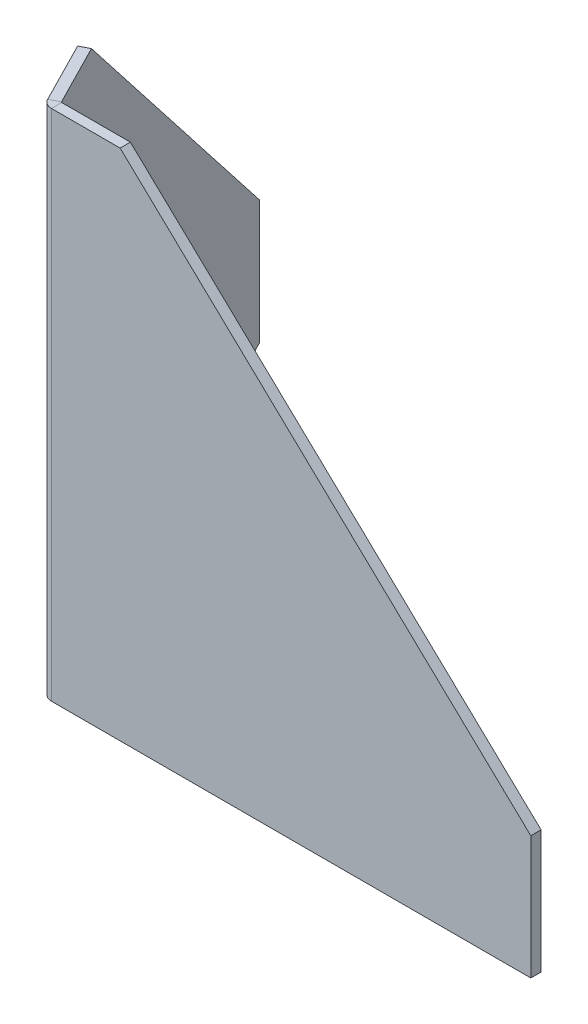
ISO-10303-21;
HEADER;
FILE_DESCRIPTION(('STEP AP214'),'2;1');
FILE_NAME('part.step','',(''),(''),'','','');
FILE_SCHEMA(('AUTOMOTIVE_DESIGN { 1 0 10303 214 1 1 1 1 }'));
ENDSEC;
DATA;
#1=APPLICATION_CONTEXT('core data for automotive mechanical design processes');
#2=APPLICATION_PROTOCOL_DEFINITION('international standard','automotive_design',2000,#1);
#3=PRODUCT_CONTEXT('',#1,'mechanical');
#4=PRODUCT('Part','Part','',(#3));
#5=PRODUCT_RELATED_PRODUCT_CATEGORY('part','',(#4));
#6=PRODUCT_DEFINITION_FORMATION('','',#4);
#7=PRODUCT_DEFINITION_CONTEXT('part definition',#1,'design');
#8=PRODUCT_DEFINITION('design','',#6,#7);
#9=PRODUCT_DEFINITION_SHAPE('','',#8);
#10=(LENGTH_UNIT() NAMED_UNIT(*) SI_UNIT(.MILLI.,.METRE.));
#11=(NAMED_UNIT(*) PLANE_ANGLE_UNIT() SI_UNIT($,.RADIAN.));
#12=(NAMED_UNIT(*) SI_UNIT($,.STERADIAN.) SOLID_ANGLE_UNIT());
#13=UNCERTAINTY_MEASURE_WITH_UNIT(LENGTH_MEASURE(1.E-05),#10,'distance_accuracy_value','');
#14=(GEOMETRIC_REPRESENTATION_CONTEXT(3) GLOBAL_UNCERTAINTY_ASSIGNED_CONTEXT((#13)) GLOBAL_UNIT_ASSIGNED_CONTEXT((#10,
#11,#12)) REPRESENTATION_CONTEXT('',''));
#15=CARTESIAN_POINT('',(0.,0.,0.));
#16=DIRECTION('',(0.,0.,1.));
#17=DIRECTION('',(1.,0.,0.));
#18=AXIS2_PLACEMENT_3D('',#15,#16,#17);
#19=CARTESIAN_POINT('',(-136368.665166535,134167.128561915,49.8948268544208));
#20=DIRECTION('',(0.891006524188369,0.,-0.453990499739545));
#21=DIRECTION('',(-0.453990499739545,0.,-0.891006524188369));
#22=AXIS2_PLACEMENT_3D('',#19,#20,#21);
#23=CYLINDRICAL_SURFACE('',#22,8.49999999999791);
#24=CARTESIAN_POINT('',(-136207.043764723,134167.128561915,-32.4553905518941));
#25=DIRECTION('',(-0.891006524188369,0.,0.453990499739545));
#26=DIRECTION('',(0.453990499739545,0.,0.891006524188369));
#27=AXIS2_PLACEMENT_3D('',#24,#25,#26);
#28=CIRCLE('',#27,8.49999999999791);
#29=CARTESIAN_POINT('',(-136203.184845475,134167.128561915,-24.8818350962948));
#30=VERTEX_POINT('',#29);
#31=EDGE_CURVE('E48',#30,#30,#28,.T.);
#32=ORIENTED_EDGE('',*,*,#31,.T.);
#33=EDGE_LOOP('',(#32));
#34=FACE_BOUND('',#33,.T.);
#35=CARTESIAN_POINT('',(-136198.133699481,134167.128561915,-36.9952955492886));
#36=DIRECTION('',(-0.891006524188369,0.,0.453990499739545));
#37=DIRECTION('',(0.453990499739545,0.,0.891006524188369));
#38=AXIS2_PLACEMENT_3D('',#35,#36,#37);
#39=CIRCLE('',#38,8.49999999999791);
#40=CARTESIAN_POINT('',(-136194.274780233,134167.128561915,-29.4217400936894));
#41=VERTEX_POINT('',#40);
#42=EDGE_CURVE('E12',#41,#41,#39,.T.);
#43=ORIENTED_EDGE('',*,*,#42,.F.);
#44=EDGE_LOOP('',(#43));
#45=FACE_BOUND('',#44,.T.);
#46=ADVANCED_FACE('F41',(#34,#45),#23,.F.);
#47=CARTESIAN_POINT('',(-136214.931347972,134227.128561915,-69.96253694426));
#48=DIRECTION('',(0.,1.,0.));
#49=DIRECTION('',(-0.891006524188369,0.,0.453990499739545));
#50=AXIS2_PLACEMENT_3D('',#47,#48,#49);
#51=PLANE('',#50);
#52=DIRECTION('',(-0.453990499739545,0.,-0.891006524188369));
#53=VECTOR('',#52,1.);
#54=CARTESIAN_POINT('',(-136223.841413213,134227.128561915,-65.4226319468592));
#55=LINE('',#54,#53);
#56=CARTESIAN_POINT('',(-136193.493900969,134227.128561915,-5.86228560048596));
#57=VERTEX_POINT('',#56);
#58=CARTESIAN_POINT('',(-136223.841413213,134227.128561915,-65.4226319468592));
#59=VERTEX_POINT('',#58);
#60=EDGE_CURVE('E63',#57,#59,#55,.T.);
#61=ORIENTED_EDGE('',*,*,#60,.F.);
#62=DIRECTION('',(0.891006524188369,0.,-0.453990499739545));
#63=VECTOR('',#62,1.);
#64=CARTESIAN_POINT('',(-136184.583835727,134227.128561915,-10.4021905978868));
#65=LINE('',#64,#63);
#66=CARTESIAN_POINT('',(-136184.583835727,134227.128561915,-10.402190597886));
#67=VERTEX_POINT('',#66);
#68=EDGE_CURVE('E116',#57,#67,#65,.T.);
#69=ORIENTED_EDGE('',*,*,#68,.T.);
#70=DIRECTION('',(-0.453990499739545,0.,-0.891006524188369));
#71=VECTOR('',#70,1.);
#72=CARTESIAN_POINT('',(-136214.931347972,134227.128561915,-69.96253694426));
#73=LINE('',#72,#71);
#74=CARTESIAN_POINT('',(-136214.931347972,134227.128561915,-69.96253694426));
#75=VERTEX_POINT('',#74);
#76=EDGE_CURVE('E119',#67,#75,#73,.T.);
#77=ORIENTED_EDGE('',*,*,#76,.T.);
#78=DIRECTION('',(-0.891006524188369,0.,0.453990499739545));
#79=VECTOR('',#78,1.);
#80=CARTESIAN_POINT('',(-136214.931347972,134227.128561915,-69.96253694426));
#81=LINE('',#80,#79);
#82=EDGE_CURVE('E149',#75,#59,#81,.T.);
#83=ORIENTED_EDGE('',*,*,#82,.T.);
#84=EDGE_LOOP('',(#61,#69,#77,#83));
#85=FACE_BOUND('',#84,.T.);
#86=ADVANCED_FACE('F118',(#85),#51,.T.);
#87=CARTESIAN_POINT('',(-136385.177785374,133727.128561915,-404.089983514908));
#88=DIRECTION('',(0.,-1.,0.));
#89=DIRECTION('',(0.891006524188369,0.,-0.453990499739545));
#90=AXIS2_PLACEMENT_3D('',#87,#88,#89);
#91=PLANE('',#90);
#92=DIRECTION('',(0.453990499739545,0.,0.891006524188369));
#93=VECTOR('',#92,1.);
#94=CARTESIAN_POINT('',(-136385.177785374,133727.128561915,-404.089983514908));
#95=LINE('',#94,#93);
#96=CARTESIAN_POINT('',(-136385.177785374,133727.128561915,-404.089983514908));
#97=VERTEX_POINT('',#96);
#98=CARTESIAN_POINT('',(-136184.583835727,133727.128561915,-10.4021905978868));
#99=VERTEX_POINT('',#98);
#100=EDGE_CURVE('E139',#97,#99,#95,.T.);
#101=ORIENTED_EDGE('',*,*,#100,.T.);
#102=DIRECTION('',(-0.891006524188369,0.,0.453990499739545));
#103=VECTOR('',#102,1.);
#104=CARTESIAN_POINT('',(-136184.583835727,133727.128561915,-10.4021905978868));
#105=LINE('',#104,#103);
#106=CARTESIAN_POINT('',(-136193.493900969,133727.128561915,-5.86228560048596));
#107=VERTEX_POINT('',#106);
#108=EDGE_CURVE('E216',#99,#107,#105,.T.);
#109=ORIENTED_EDGE('',*,*,#108,.T.);
#110=DIRECTION('',(0.453990499739545,0.,0.891006524188369));
#111=VECTOR('',#110,1.);
#112=CARTESIAN_POINT('',(-136394.087850616,133727.128561915,-399.550078517507));
#113=LINE('',#112,#111);
#114=CARTESIAN_POINT('',(-136394.087850616,133727.128561915,-399.550078517507));
#115=VERTEX_POINT('',#114);
#116=EDGE_CURVE('E55',#115,#107,#113,.T.);
#117=ORIENTED_EDGE('',*,*,#116,.F.);
#118=DIRECTION('',(-0.891006524188369,0.,0.453990499739545));
#119=VECTOR('',#118,1.);
#120=CARTESIAN_POINT('',(-136385.177785374,133727.128561915,-404.089983514908));
#121=LINE('',#120,#119);
#122=EDGE_CURVE('E212',#97,#115,#121,.T.);
#123=ORIENTED_EDGE('',*,*,#122,.F.);
#124=EDGE_LOOP('',(#101,#109,#117,#123));
#125=FACE_BOUND('',#124,.T.);
#126=ADVANCED_FACE('F232',(#125),#91,.T.);
#127=CARTESIAN_POINT('',(-74364.4209440493,0.,121340.525845296));
#128=DIRECTION('',(-0.891006524188369,0.,0.453990499739545));
#129=DIRECTION('',(0.453990499739545,0.,0.891006524188369));
#130=AXIS2_PLACEMENT_3D('',#127,#128,#129);
#131=PLANE('',#130);
#132=CARTESIAN_POINT('',(-136207.043764723,133977.128561915,-32.4553905518941));
#133=DIRECTION('',(-0.891006524188369,0.,0.453990499739545));
#134=DIRECTION('',(0.453990499739545,0.,0.891006524188369));
#135=AXIS2_PLACEMENT_3D('',#132,#133,#134);
#136=CIRCLE('',#135,8.49999999999791);
#137=CARTESIAN_POINT('',(-136203.184845475,133977.128561915,-24.8818350962948));
#138=VERTEX_POINT('',#137);
#139=EDGE_CURVE('E306',#138,#138,#136,.T.);
#140=ORIENTED_EDGE('',*,*,#139,.F.);
#141=EDGE_LOOP('',(#140));
#142=FACE_BOUND('',#141,.T.);
#143=CARTESIAN_POINT('',(-136207.043764723,133787.128561915,-32.4553905518941));
#144=DIRECTION('',(-0.891006524188369,0.,0.453990499739545));
#145=DIRECTION('',(0.453990499739545,0.,0.891006524188369));
#146=AXIS2_PLACEMENT_3D('',#143,#144,#145);
#147=CIRCLE('',#146,8.49999999999791);
#148=CARTESIAN_POINT('',(-136203.184845475,133787.128561915,-24.8818350962948));
#149=VERTEX_POINT('',#148);
#150=EDGE_CURVE('E168',#149,#149,#147,.T.);
#151=ORIENTED_EDGE('',*,*,#150,.F.);
#152=EDGE_LOOP('',(#151));
#153=FACE_BOUND('',#152,.T.);
#154=ORIENTED_EDGE('',*,*,#116,.T.);
#155=DIRECTION('',(0.,1.,0.));
#156=VECTOR('',#155,1.);
#157=CARTESIAN_POINT('',(-136193.493900969,0.,-5.86228560048596));
#158=LINE('',#157,#156);
#159=EDGE_CURVE('E125',#107,#57,#158,.T.);
#160=ORIENTED_EDGE('',*,*,#159,.T.);
#161=ORIENTED_EDGE('',*,*,#60,.T.);
#162=DIRECTION('',(-0.318886809529834,-0.711773999328797,-0.625850602450276));
#163=VECTOR('',#162,1.);
#164=CARTESIAN_POINT('',(-136394.087850616,133847.128561915,-399.550078517507));
#165=LINE('',#164,#163);
#166=CARTESIAN_POINT('',(-136394.087850616,133847.128561915,-399.550078517507));
#167=VERTEX_POINT('',#166);
#168=EDGE_CURVE('E172',#59,#167,#165,.T.);
#169=ORIENTED_EDGE('',*,*,#168,.T.);
#170=DIRECTION('',(0.,-1.,0.));
#171=VECTOR('',#170,1.);
#172=CARTESIAN_POINT('',(-136394.087850616,133727.128561915,-399.550078517507));
#173=LINE('',#172,#171);
#174=EDGE_CURVE('E209',#167,#115,#173,.T.);
#175=ORIENTED_EDGE('',*,*,#174,.T.);
#176=EDGE_LOOP('',(#154,#160,#161,#169,#175));
#177=FACE_BOUND('',#176,.T.);
#178=ORIENTED_EDGE('',*,*,#31,.F.);
#179=EDGE_LOOP('',(#178));
#180=FACE_BOUND('',#179,.T.);
#181=ADVANCED_FACE('F229',(#142,#153,#177,#180),#131,.T.);
#182=CARTESIAN_POINT('',(-136385.177785374,133847.128561915,-404.089983514908));
#183=DIRECTION('',(-0.323138633656895,0.702408551969216,-0.634195277149605));
#184=DIRECTION('',(-0.318886809529834,-0.711773999328797,-0.625850602450276));
#185=AXIS2_PLACEMENT_3D('',#182,#183,#184);
#186=PLANE('',#185);
#187=ORIENTED_EDGE('',*,*,#168,.F.);
#188=ORIENTED_EDGE('',*,*,#82,.F.);
#189=DIRECTION('',(-0.318886809529834,-0.711773999328797,-0.625850602450276));
#190=VECTOR('',#189,1.);
#191=CARTESIAN_POINT('',(-136385.177785374,133847.128561915,-404.089983514908));
#192=LINE('',#191,#190);
#193=CARTESIAN_POINT('',(-136385.177785374,133847.128561915,-404.089983514908));
#194=VERTEX_POINT('',#193);
#195=EDGE_CURVE('E137',#75,#194,#192,.T.);
#196=ORIENTED_EDGE('',*,*,#195,.T.);
#197=DIRECTION('',(-0.891006524188369,0.,0.453990499739545));
#198=VECTOR('',#197,1.);
#199=CARTESIAN_POINT('',(-136385.177785374,133847.128561915,-404.089983514908));
#200=LINE('',#199,#198);
#201=EDGE_CURVE('E138',#194,#167,#200,.T.);
#202=ORIENTED_EDGE('',*,*,#201,.T.);
#203=EDGE_LOOP('',(#187,#188,#196,#202));
#204=FACE_BOUND('',#203,.T.);
#205=ADVANCED_FACE('F231',(#204),#186,.T.);
#206=CARTESIAN_POINT('',(-136385.177785374,133727.128561915,-404.089983514908));
#207=DIRECTION('',(-0.453990499739545,0.,-0.891006524188369));
#208=DIRECTION('',(-0.891006524188369,0.,0.453990499739545));
#209=AXIS2_PLACEMENT_3D('',#206,#207,#208);
#210=PLANE('',#209);
#211=ORIENTED_EDGE('',*,*,#174,.F.);
#212=ORIENTED_EDGE('',*,*,#201,.F.);
#213=DIRECTION('',(0.,-1.,0.));
#214=VECTOR('',#213,1.);
#215=CARTESIAN_POINT('',(-136385.177785374,133727.128561915,-404.089983514908));
#216=LINE('',#215,#214);
#217=EDGE_CURVE('E204',#194,#97,#216,.T.);
#218=ORIENTED_EDGE('',*,*,#217,.T.);
#219=ORIENTED_EDGE('',*,*,#122,.T.);
#220=EDGE_LOOP('',(#211,#212,#218,#219));
#221=FACE_BOUND('',#220,.T.);
#222=ADVANCED_FACE('F239',(#221),#210,.T.);
#223=CARTESIAN_POINT('',(-74355.5108788075,0.,121335.985940298));
#224=DIRECTION('',(-0.891006524188369,0.,0.453990499739545));
#225=DIRECTION('',(0.453990499739545,0.,0.891006524188369));
#226=AXIS2_PLACEMENT_3D('',#223,#224,#225);
#227=PLANE('',#226);
#228=CARTESIAN_POINT('',(-136198.133699481,133977.128561915,-36.9952955492886));
#229=DIRECTION('',(-0.891006524188369,0.,0.453990499739545));
#230=DIRECTION('',(0.453990499739545,0.,0.891006524188369));
#231=AXIS2_PLACEMENT_3D('',#228,#229,#230);
#232=CIRCLE('',#231,8.49999999999791);
#233=CARTESIAN_POINT('',(-136194.274780233,133977.128561915,-29.4217400936894));
#234=VERTEX_POINT('',#233);
#235=EDGE_CURVE('E223',#234,#234,#232,.T.);
#236=ORIENTED_EDGE('',*,*,#235,.T.);
#237=EDGE_LOOP('',(#236));
#238=FACE_BOUND('',#237,.T.);
#239=CARTESIAN_POINT('',(-136198.133699481,133787.128561915,-36.9952955492886));
#240=DIRECTION('',(-0.891006524188369,0.,0.453990499739545));
#241=DIRECTION('',(0.453990499739545,0.,0.891006524188369));
#242=AXIS2_PLACEMENT_3D('',#239,#240,#241);
#243=CIRCLE('',#242,8.49999999999791);
#244=CARTESIAN_POINT('',(-136194.274780233,133787.128561915,-29.4217400936894));
#245=VERTEX_POINT('',#244);
#246=EDGE_CURVE('E221',#245,#245,#243,.T.);
#247=ORIENTED_EDGE('',*,*,#246,.T.);
#248=EDGE_LOOP('',(#247));
#249=FACE_BOUND('',#248,.T.);
#250=DIRECTION('',(0.,1.,0.));
#251=VECTOR('',#250,1.);
#252=CARTESIAN_POINT('',(-136184.583835727,0.,-10.4021905978868));
#253=LINE('',#252,#251);
#254=EDGE_CURVE('E126',#99,#67,#253,.T.);
#255=ORIENTED_EDGE('',*,*,#254,.F.);
#256=ORIENTED_EDGE('',*,*,#100,.F.);
#257=ORIENTED_EDGE('',*,*,#217,.F.);
#258=ORIENTED_EDGE('',*,*,#195,.F.);
#259=ORIENTED_EDGE('',*,*,#76,.F.);
#260=EDGE_LOOP('',(#255,#256,#257,#258,#259));
#261=FACE_BOUND('',#260,.T.);
#262=ORIENTED_EDGE('',*,*,#42,.T.);
#263=EDGE_LOOP('',(#262));
#264=FACE_BOUND('',#263,.T.);
#265=ADVANCED_FACE('F131',(#238,#249,#261,#264),#227,.F.);
#266=CARTESIAN_POINT('',(-135717.081380895,133727.128561915,-10.));
#267=DIRECTION('',(1.,0.,0.));
#268=DIRECTION('',(0.,0.,-1.));
#269=AXIS2_PLACEMENT_3D('',#266,#267,#268);
#270=PLANE('',#269);
#271=DIRECTION('',(0.,1.,0.));
#272=VECTOR('',#271,1.);
#273=CARTESIAN_POINT('',(-135717.081380895,133727.128561915,0.));
#274=LINE('',#273,#272);
#275=CARTESIAN_POINT('',(-135717.081380895,133727.128561915,0.));
#276=VERTEX_POINT('',#275);
#277=CARTESIAN_POINT('',(-135717.081380895,133847.128561915,0.));
#278=VERTEX_POINT('',#277);
#279=EDGE_CURVE('E180',#276,#278,#274,.T.);
#280=ORIENTED_EDGE('',*,*,#279,.F.);
#281=DIRECTION('',(0.,0.,1.));
#282=VECTOR('',#281,1.);
#283=CARTESIAN_POINT('',(-135717.081380895,133727.128561915,-10.));
#284=LINE('',#283,#282);
#285=CARTESIAN_POINT('',(-135717.081380895,133727.128561915,-10.));
#286=VERTEX_POINT('',#285);
#287=EDGE_CURVE('E169',#286,#276,#284,.T.);
#288=ORIENTED_EDGE('',*,*,#287,.F.);
#289=DIRECTION('',(0.,1.,0.));
#290=VECTOR('',#289,1.);
#291=CARTESIAN_POINT('',(-135717.081380895,133727.128561915,-10.));
#292=LINE('',#291,#290);
#293=CARTESIAN_POINT('',(-135717.081380895,133847.128561915,-10.));
#294=VERTEX_POINT('',#293);
#295=EDGE_CURVE('E197',#286,#294,#292,.T.);
#296=ORIENTED_EDGE('',*,*,#295,.T.);
#297=DIRECTION('',(0.,0.,1.));
#298=VECTOR('',#297,1.);
#299=CARTESIAN_POINT('',(-135717.081380895,133847.128561915,-10.));
#300=LINE('',#299,#298);
#301=EDGE_CURVE('E195',#294,#278,#300,.T.);
#302=ORIENTED_EDGE('',*,*,#301,.T.);
#303=EDGE_LOOP('',(#280,#288,#296,#302));
#304=FACE_BOUND('',#303,.T.);
#305=ADVANCED_FACE('F254',(#304),#270,.T.);
#306=CARTESIAN_POINT('',(-135717.081380895,133847.128561915,-10.));
#307=DIRECTION('',(0.688749461914709,0.724999433594398,0.));
#308=DIRECTION('',(-0.724999433594398,0.688749461914709,0.));
#309=AXIS2_PLACEMENT_3D('',#306,#307,#308);
#310=PLANE('',#309);
#311=DIRECTION('',(-0.724999433594398,0.688749461914709,0.));
#312=VECTOR('',#311,1.);
#313=CARTESIAN_POINT('',(-135717.081380895,133847.128561915,0.));
#314=LINE('',#313,#312);
#315=CARTESIAN_POINT('',(-136117.081380895,134227.128561915,0.));
#316=VERTEX_POINT('',#315);
#317=EDGE_CURVE('E177',#278,#316,#314,.T.);
#318=ORIENTED_EDGE('',*,*,#317,.F.);
#319=ORIENTED_EDGE('',*,*,#301,.F.);
#320=DIRECTION('',(-0.724999433594398,0.688749461914709,0.));
#321=VECTOR('',#320,1.);
#322=CARTESIAN_POINT('',(-135717.081380895,133847.128561915,-10.));
#323=LINE('',#322,#321);
#324=CARTESIAN_POINT('',(-136117.081380895,134227.128561915,-10.));
#325=VERTEX_POINT('',#324);
#326=EDGE_CURVE('E192',#294,#325,#323,.T.);
#327=ORIENTED_EDGE('',*,*,#326,.T.);
#328=DIRECTION('',(0.,0.,1.));
#329=VECTOR('',#328,1.);
#330=CARTESIAN_POINT('',(-136117.081380895,134227.128561915,-10.));
#331=LINE('',#330,#329);
#332=EDGE_CURVE('E190',#325,#316,#331,.T.);
#333=ORIENTED_EDGE('',*,*,#332,.T.);
#334=EDGE_LOOP('',(#318,#319,#327,#333));
#335=FACE_BOUND('',#334,.T.);
#336=ADVANCED_FACE('F276',(#335),#310,.T.);
#337=CARTESIAN_POINT('',(0.,0.,-10.));
#338=DIRECTION('',(0.,0.,1.));
#339=DIRECTION('',(1.,0.,0.));
#340=AXIS2_PLACEMENT_3D('',#337,#338,#339);
#341=PLANE('',#340);
#342=DIRECTION('',(1.,0.,0.));
#343=VECTOR('',#342,1.);
#344=CARTESIAN_POINT('',(-136632.081380895,133727.128561915,-10.));
#345=LINE('',#344,#343);
#346=CARTESIAN_POINT('',(-136183.927520322,133727.128561915,-10.));
#347=VERTEX_POINT('',#346);
#348=EDGE_CURVE('E173',#347,#286,#345,.T.);
#349=ORIENTED_EDGE('',*,*,#348,.F.);
#350=DIRECTION('',(0.,1.,0.));
#351=VECTOR('',#350,1.);
#352=CARTESIAN_POINT('',(-136183.927520322,0.,-10.));
#353=LINE('',#352,#351);
#354=CARTESIAN_POINT('',(-136183.927520322,134227.128561915,-10.0000000000035));
#355=VERTEX_POINT('',#354);
#356=EDGE_CURVE('E187',#347,#355,#353,.T.);
#357=ORIENTED_EDGE('',*,*,#356,.T.);
#358=DIRECTION('',(-1.,0.,0.));
#359=VECTOR('',#358,1.);
#360=CARTESIAN_POINT('',(-136257.081380895,134227.128561915,-10.));
#361=LINE('',#360,#359);
#362=EDGE_CURVE('E185',#325,#355,#361,.T.);
#363=ORIENTED_EDGE('',*,*,#362,.F.);
#364=ORIENTED_EDGE('',*,*,#326,.F.);
#365=ORIENTED_EDGE('',*,*,#295,.F.);
#366=EDGE_LOOP('',(#349,#357,#363,#364,#365));
#367=FACE_BOUND('',#366,.T.);
#368=ADVANCED_FACE('F272',(#367),#341,.F.);
#369=CARTESIAN_POINT('',(-136257.081380895,134227.128561915,-10.));
#370=DIRECTION('',(0.,1.,0.));
#371=DIRECTION('',(0.,0.,1.));
#372=AXIS2_PLACEMENT_3D('',#369,#370,#371);
#373=PLANE('',#372);
#374=DIRECTION('',(0.,0.,-1.));
#375=VECTOR('',#374,1.);
#376=CARTESIAN_POINT('',(-136183.927520322,134227.128561915,-10.));
#377=LINE('',#376,#375);
#378=CARTESIAN_POINT('',(-136183.927520322,134227.128561915,0.));
#379=VERTEX_POINT('',#378);
#380=EDGE_CURVE('E154',#379,#355,#377,.T.);
#381=ORIENTED_EDGE('',*,*,#380,.F.);
#382=DIRECTION('',(-1.,0.,0.));
#383=VECTOR('',#382,1.);
#384=CARTESIAN_POINT('',(-136257.081380895,134227.128561915,0.));
#385=LINE('',#384,#383);
#386=EDGE_CURVE('E175',#316,#379,#385,.T.);
#387=ORIENTED_EDGE('',*,*,#386,.F.);
#388=ORIENTED_EDGE('',*,*,#332,.F.);
#389=ORIENTED_EDGE('',*,*,#362,.T.);
#390=EDGE_LOOP('',(#381,#387,#388,#389));
#391=FACE_BOUND('',#390,.T.);
#392=ADVANCED_FACE('F268',(#391),#373,.T.);
#393=CARTESIAN_POINT('',(0.,0.,0.));
#394=DIRECTION('',(0.,0.,1.));
#395=DIRECTION('',(1.,0.,0.));
#396=AXIS2_PLACEMENT_3D('',#393,#394,#395);
#397=PLANE('',#396);
#398=DIRECTION('',(0.,1.,0.));
#399=VECTOR('',#398,1.);
#400=CARTESIAN_POINT('',(-136183.927520322,0.,0.));
#401=LINE('',#400,#399);
#402=CARTESIAN_POINT('',(-136183.927520322,133727.128561915,0.));
#403=VERTEX_POINT('',#402);
#404=EDGE_CURVE('E158',#403,#379,#401,.T.);
#405=ORIENTED_EDGE('',*,*,#404,.F.);
#406=DIRECTION('',(1.,0.,0.));
#407=VECTOR('',#406,1.);
#408=CARTESIAN_POINT('',(-136632.081380895,133727.128561915,0.));
#409=LINE('',#408,#407);
#410=EDGE_CURVE('E183',#403,#276,#409,.T.);
#411=ORIENTED_EDGE('',*,*,#410,.T.);
#412=ORIENTED_EDGE('',*,*,#279,.T.);
#413=ORIENTED_EDGE('',*,*,#317,.T.);
#414=ORIENTED_EDGE('',*,*,#386,.T.);
#415=EDGE_LOOP('',(#405,#411,#412,#413,#414));
#416=FACE_BOUND('',#415,.T.);
#417=ADVANCED_FACE('F264',(#416),#397,.T.);
#418=CARTESIAN_POINT('',(-136632.081380895,133727.128561915,-10.));
#419=DIRECTION('',(0.,-1.,0.));
#420=DIRECTION('',(0.,0.,-1.));
#421=AXIS2_PLACEMENT_3D('',#418,#419,#420);
#422=PLANE('',#421);
#423=DIRECTION('',(0.,0.,1.));
#424=VECTOR('',#423,1.);
#425=CARTESIAN_POINT('',(-136183.927520322,133727.128561915,-10.));
#426=LINE('',#425,#424);
#427=EDGE_CURVE('E155',#347,#403,#426,.T.);
#428=ORIENTED_EDGE('',*,*,#427,.F.);
#429=ORIENTED_EDGE('',*,*,#348,.T.);
#430=ORIENTED_EDGE('',*,*,#287,.T.);
#431=ORIENTED_EDGE('',*,*,#410,.F.);
#432=EDGE_LOOP('',(#428,#429,#430,#431));
#433=FACE_BOUND('',#432,.T.);
#434=ADVANCED_FACE('F260',(#433),#422,.T.);
#435=CARTESIAN_POINT('',(-136183.927520322,133727.128561915,-10.7366));
#436=DIRECTION('',(0.,1.,0.));
#437=DIRECTION('',(0.,0.,1.));
#438=AXIS2_PLACEMENT_3D('',#435,#436,#437);
#439=PLANE('',#438);
#440=ORIENTED_EDGE('',*,*,#427,.T.);
#441=CARTESIAN_POINT('',(-136183.927520322,133727.128561915,-10.7366));
#442=DIRECTION('',(0.,1.,0.));
#443=DIRECTION('',(0.,0.,1.));
#444=AXIS2_PLACEMENT_3D('',#441,#442,#443);
#445=CIRCLE('',#444,10.7366);
#446=EDGE_CURVE('E165',#403,#107,#445,.F.);
#447=ORIENTED_EDGE('',*,*,#446,.T.);
#448=ORIENTED_EDGE('',*,*,#108,.F.);
#449=CARTESIAN_POINT('',(-136183.927520322,133727.128561915,-10.7366));
#450=DIRECTION('',(0.,-1.,0.));
#451=DIRECTION('',(0.,0.,1.));
#452=AXIS2_PLACEMENT_3D('',#449,#450,#451);
#453=CIRCLE('',#452,0.736599999996462);
#454=EDGE_CURVE('E148',#347,#99,#453,.T.);
#455=ORIENTED_EDGE('',*,*,#454,.F.);
#456=EDGE_LOOP('',(#440,#447,#448,#455));
#457=FACE_BOUND('',#456,.T.);
#458=ADVANCED_FACE('F263',(#457),#439,.F.);
#459=CARTESIAN_POINT('',(-136183.927520322,134227.128561915,-10.7366));
#460=DIRECTION('',(0.,-1.,0.));
#461=DIRECTION('',(0.,0.,-1.));
#462=AXIS2_PLACEMENT_3D('',#459,#460,#461);
#463=PLANE('',#462);
#464=ORIENTED_EDGE('',*,*,#68,.F.);
#465=CARTESIAN_POINT('',(-136183.927520322,134227.128561915,-10.7366));
#466=DIRECTION('',(0.,1.,0.));
#467=DIRECTION('',(0.,0.,1.));
#468=AXIS2_PLACEMENT_3D('',#465,#466,#467);
#469=CIRCLE('',#468,10.7366);
#470=EDGE_CURVE('E160',#57,#379,#469,.T.);
#471=ORIENTED_EDGE('',*,*,#470,.T.);
#472=ORIENTED_EDGE('',*,*,#380,.T.);
#473=CARTESIAN_POINT('',(-136183.927520322,134227.128561915,-10.7366));
#474=DIRECTION('',(0.,1.,0.));
#475=DIRECTION('',(0.,0.,-1.));
#476=AXIS2_PLACEMENT_3D('',#473,#474,#475);
#477=CIRCLE('',#476,0.736599999996462);
#478=EDGE_CURVE('E146',#67,#355,#477,.T.);
#479=ORIENTED_EDGE('',*,*,#478,.F.);
#480=EDGE_LOOP('',(#464,#471,#472,#479));
#481=FACE_BOUND('',#480,.T.);
#482=ADVANCED_FACE('F152',(#481),#463,.F.);
#483=CARTESIAN_POINT('',(-136183.927520322,133476.988794104,-10.7366));
#484=DIRECTION('',(0.,1.,0.));
#485=DIRECTION('',(0.,0.,1.));
#486=AXIS2_PLACEMENT_3D('',#483,#484,#485);
#487=CYLINDRICAL_SURFACE('',#486,0.7366);
#488=ORIENTED_EDGE('',*,*,#478,.T.);
#489=ORIENTED_EDGE('',*,*,#356,.F.);
#490=ORIENTED_EDGE('',*,*,#454,.T.);
#491=ORIENTED_EDGE('',*,*,#254,.T.);
#492=EDGE_LOOP('',(#488,#489,#490,#491));
#493=FACE_BOUND('',#492,.T.);
#494=ADVANCED_FACE('F144',(#493),#487,.F.);
#495=CARTESIAN_POINT('',(-136183.927520322,133476.988794104,-10.7366));
#496=DIRECTION('',(0.,1.,0.));
#497=DIRECTION('',(0.,0.,1.));
#498=AXIS2_PLACEMENT_3D('',#495,#496,#497);
#499=CYLINDRICAL_SURFACE('',#498,10.7366);
#500=ORIENTED_EDGE('',*,*,#470,.F.);
#501=ORIENTED_EDGE('',*,*,#159,.F.);
#502=ORIENTED_EDGE('',*,*,#446,.F.);
#503=ORIENTED_EDGE('',*,*,#404,.T.);
#504=EDGE_LOOP('',(#500,#501,#502,#503));
#505=FACE_BOUND('',#504,.T.);
#506=ADVANCED_FACE('F289',(#505),#499,.T.);
#507=CARTESIAN_POINT('',(-136368.665166535,133787.128561915,49.8948268544208));
#508=DIRECTION('',(0.891006524188369,0.,-0.453990499739545));
#509=DIRECTION('',(-0.453990499739545,0.,-0.891006524188369));
#510=AXIS2_PLACEMENT_3D('',#507,#508,#509);
#511=CYLINDRICAL_SURFACE('',#510,8.49999999999791);
#512=ORIENTED_EDGE('',*,*,#150,.T.);
#513=EDGE_LOOP('',(#512));
#514=FACE_BOUND('',#513,.T.);
#515=ORIENTED_EDGE('',*,*,#246,.F.);
#516=EDGE_LOOP('',(#515));
#517=FACE_BOUND('',#516,.T.);
#518=ADVANCED_FACE('F292',(#514,#517),#511,.F.);
#519=CARTESIAN_POINT('',(-136368.665166535,133977.128561915,49.8948268544208));
#520=DIRECTION('',(0.891006524188369,0.,-0.453990499739545));
#521=DIRECTION('',(-0.453990499739545,0.,-0.891006524188369));
#522=AXIS2_PLACEMENT_3D('',#519,#520,#521);
#523=CYLINDRICAL_SURFACE('',#522,8.49999999999791);
#524=ORIENTED_EDGE('',*,*,#139,.T.);
#525=EDGE_LOOP('',(#524));
#526=FACE_BOUND('',#525,.T.);
#527=ORIENTED_EDGE('',*,*,#235,.F.);
#528=EDGE_LOOP('',(#527));
#529=FACE_BOUND('',#528,.T.);
#530=ADVANCED_FACE('F298',(#526,#529),#523,.F.);
#531=CLOSED_SHELL('',(#46,#86,#126,#181,#205,#222,#265,#305,#336,#368,#392,#417,#434,#458,#482,
#494,#506,#518,#530));
#532=MANIFOLD_SOLID_BREP('B2',#531);
#533=ADVANCED_BREP_SHAPE_REPRESENTATION('',(#18,#532),#14);
#534=SHAPE_DEFINITION_REPRESENTATION(#9,#533);
ENDSEC;
END-ISO-10303-21;
